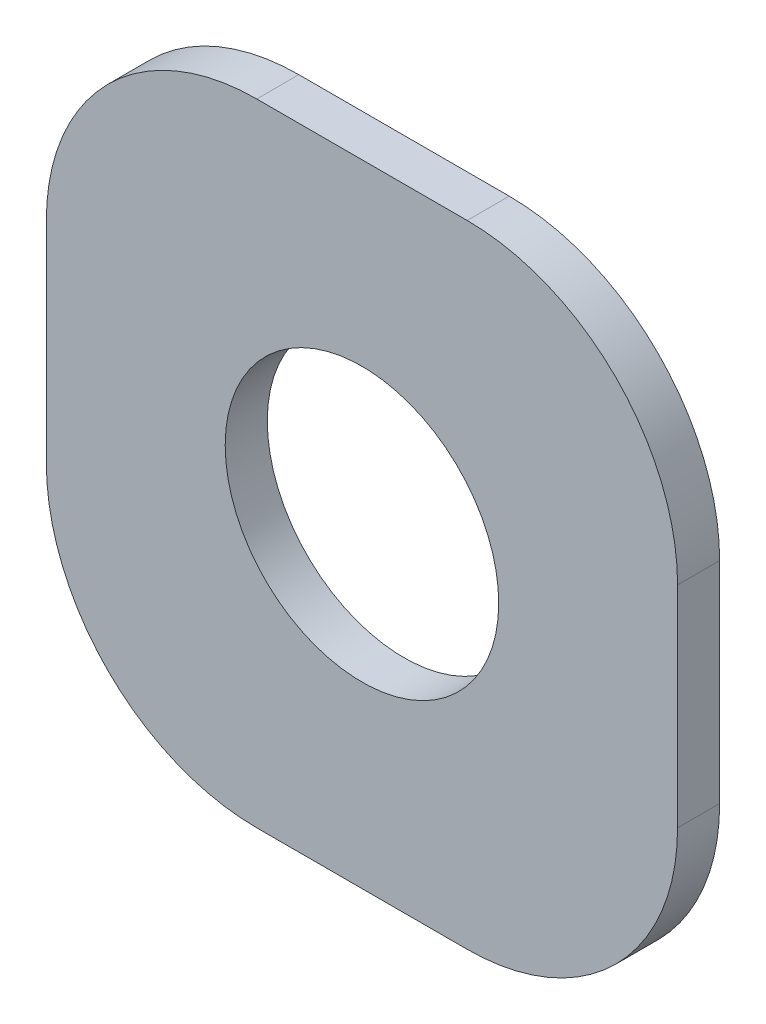
ISO-10303-21;
HEADER;
FILE_DESCRIPTION(('STEP AP214'),'2;1');
FILE_NAME('part.step','',(''),(''),'','','');
FILE_SCHEMA(('AUTOMOTIVE_DESIGN { 1 0 10303 214 1 1 1 1 }'));
ENDSEC;
DATA;
#1=APPLICATION_CONTEXT('core data for automotive mechanical design processes');
#2=APPLICATION_PROTOCOL_DEFINITION('international standard','automotive_design',2000,#1);
#3=PRODUCT_CONTEXT('',#1,'mechanical');
#4=PRODUCT('Part','Part','',(#3));
#5=PRODUCT_RELATED_PRODUCT_CATEGORY('part','',(#4));
#6=PRODUCT_DEFINITION_FORMATION('','',#4);
#7=PRODUCT_DEFINITION_CONTEXT('part definition',#1,'design');
#8=PRODUCT_DEFINITION('design','',#6,#7);
#9=PRODUCT_DEFINITION_SHAPE('','',#8);
#10=(LENGTH_UNIT() NAMED_UNIT(*) SI_UNIT(.MILLI.,.METRE.));
#11=(NAMED_UNIT(*) PLANE_ANGLE_UNIT() SI_UNIT($,.RADIAN.));
#12=(NAMED_UNIT(*) SI_UNIT($,.STERADIAN.) SOLID_ANGLE_UNIT());
#13=UNCERTAINTY_MEASURE_WITH_UNIT(LENGTH_MEASURE(1.E-05),#10,'distance_accuracy_value','');
#14=(GEOMETRIC_REPRESENTATION_CONTEXT(3) GLOBAL_UNCERTAINTY_ASSIGNED_CONTEXT((#13)) GLOBAL_UNIT_ASSIGNED_CONTEXT((#10,
#11,#12)) REPRESENTATION_CONTEXT('',''));
#15=CARTESIAN_POINT('',(0.,0.,0.));
#16=DIRECTION('',(0.,0.,1.));
#17=DIRECTION('',(1.,0.,0.));
#18=AXIS2_PLACEMENT_3D('',#15,#16,#17);
#19=CARTESIAN_POINT('',(-74.9999999999999,-74.9999999999999,75.));
#20=DIRECTION('',(0.,-1.,0.));
#21=DIRECTION('',(0.,0.,-1.));
#22=AXIS2_PLACEMENT_3D('',#19,#20,#21);
#23=PLANE('',#22);
#24=DIRECTION('',(1.,0.,0.));
#25=VECTOR('',#24,1.);
#26=CARTESIAN_POINT('',(-74.9999999999999,-74.9999999999999,75.));
#27=LINE('',#26,#25);
#28=CARTESIAN_POINT('',(-24.9999999999999,-74.9999999999999,75.));
#29=VERTEX_POINT('',#28);
#30=CARTESIAN_POINT('',(25.,-74.9999999999999,75.));
#31=VERTEX_POINT('',#30);
#32=EDGE_CURVE('E190',#29,#31,#27,.T.);
#33=ORIENTED_EDGE('',*,*,#32,.T.);
#34=DIRECTION('',(0.,0.,1.));
#35=VECTOR('',#34,1.);
#36=CARTESIAN_POINT('',(25.,-74.9999999999999,75.));
#37=LINE('',#36,#35);
#38=CARTESIAN_POINT('',(25.,-74.9999999999999,85.));
#39=VERTEX_POINT('',#38);
#40=EDGE_CURVE('E130',#31,#39,#37,.T.);
#41=ORIENTED_EDGE('',*,*,#40,.T.);
#42=DIRECTION('',(1.,0.,0.));
#43=VECTOR('',#42,1.);
#44=CARTESIAN_POINT('',(-74.9999999999999,-74.9999999999999,85.));
#45=LINE('',#44,#43);
#46=CARTESIAN_POINT('',(-24.9999999999999,-74.9999999999999,85.));
#47=VERTEX_POINT('',#46);
#48=EDGE_CURVE('E113',#47,#39,#45,.T.);
#49=ORIENTED_EDGE('',*,*,#48,.F.);
#50=DIRECTION('',(0.,0.,1.));
#51=VECTOR('',#50,1.);
#52=CARTESIAN_POINT('',(-24.9999999999999,-74.9999999999999,75.));
#53=LINE('',#52,#51);
#54=EDGE_CURVE('E127',#47,#29,#53,.F.);
#55=ORIENTED_EDGE('',*,*,#54,.T.);
#56=EDGE_LOOP('',(#33,#41,#49,#55));
#57=FACE_BOUND('',#56,.T.);
#58=ADVANCED_FACE('F44',(#57),#23,.T.);
#59=CARTESIAN_POINT('',(-74.9999999999999,-74.9999999999999,75.));
#60=DIRECTION('',(-1.,0.,0.));
#61=DIRECTION('',(0.,0.,1.));
#62=AXIS2_PLACEMENT_3D('',#59,#60,#61);
#63=PLANE('',#62);
#64=DIRECTION('',(0.,-1.,0.));
#65=VECTOR('',#64,1.);
#66=CARTESIAN_POINT('',(-74.9999999999999,-74.9999999999999,75.));
#67=LINE('',#66,#65);
#68=CARTESIAN_POINT('',(-74.9999999999999,25.,75.));
#69=VERTEX_POINT('',#68);
#70=CARTESIAN_POINT('',(-74.9999999999999,-24.9999999999999,75.));
#71=VERTEX_POINT('',#70);
#72=EDGE_CURVE('E139',#69,#71,#67,.T.);
#73=ORIENTED_EDGE('',*,*,#72,.T.);
#74=DIRECTION('',(0.,0.,1.));
#75=VECTOR('',#74,1.);
#76=CARTESIAN_POINT('',(-74.9999999999999,-24.9999999999999,75.));
#77=LINE('',#76,#75);
#78=CARTESIAN_POINT('',(-74.9999999999999,-24.9999999999999,85.));
#79=VERTEX_POINT('',#78);
#80=EDGE_CURVE('E177',#71,#79,#77,.T.);
#81=ORIENTED_EDGE('',*,*,#80,.T.);
#82=DIRECTION('',(0.,-1.,0.));
#83=VECTOR('',#82,1.);
#84=CARTESIAN_POINT('',(-74.9999999999999,-74.9999999999999,85.));
#85=LINE('',#84,#83);
#86=CARTESIAN_POINT('',(-74.9999999999999,25.,85.));
#87=VERTEX_POINT('',#86);
#88=EDGE_CURVE('E115',#87,#79,#85,.T.);
#89=ORIENTED_EDGE('',*,*,#88,.F.);
#90=DIRECTION('',(0.,0.,1.));
#91=VECTOR('',#90,1.);
#92=CARTESIAN_POINT('',(-74.9999999999999,25.,75.));
#93=LINE('',#92,#91);
#94=EDGE_CURVE('E174',#87,#69,#93,.F.);
#95=ORIENTED_EDGE('',*,*,#94,.T.);
#96=EDGE_LOOP('',(#73,#81,#89,#95));
#97=FACE_BOUND('',#96,.T.);
#98=ADVANCED_FACE('F228',(#97),#63,.T.);
#99=CARTESIAN_POINT('',(-74.9999999999999,75.0000000000001,75.));
#100=DIRECTION('',(0.,1.,0.));
#101=DIRECTION('',(-1.,0.,0.));
#102=AXIS2_PLACEMENT_3D('',#99,#100,#101);
#103=PLANE('',#102);
#104=DIRECTION('',(-1.,0.,0.));
#105=VECTOR('',#104,1.);
#106=CARTESIAN_POINT('',(-74.9999999999999,75.0000000000001,85.));
#107=LINE('',#106,#105);
#108=CARTESIAN_POINT('',(25.,75.,85.));
#109=VERTEX_POINT('',#108);
#110=CARTESIAN_POINT('',(-24.9999999999998,75.,85.));
#111=VERTEX_POINT('',#110);
#112=EDGE_CURVE('E184',#109,#111,#107,.T.);
#113=ORIENTED_EDGE('',*,*,#112,.F.);
#114=DIRECTION('',(0.,0.,1.));
#115=VECTOR('',#114,1.);
#116=CARTESIAN_POINT('',(25.,75.,75.));
#117=LINE('',#116,#115);
#118=CARTESIAN_POINT('',(25.,75.,75.));
#119=VERTEX_POINT('',#118);
#120=EDGE_CURVE('E11',#109,#119,#117,.F.);
#121=ORIENTED_EDGE('',*,*,#120,.T.);
#122=DIRECTION('',(-1.,0.,0.));
#123=VECTOR('',#122,1.);
#124=CARTESIAN_POINT('',(-74.9999999999999,75.0000000000001,75.));
#125=LINE('',#124,#123);
#126=CARTESIAN_POINT('',(-24.9999999999998,75.,75.));
#127=VERTEX_POINT('',#126);
#128=EDGE_CURVE('E146',#119,#127,#125,.T.);
#129=ORIENTED_EDGE('',*,*,#128,.T.);
#130=DIRECTION('',(0.,0.,1.));
#131=VECTOR('',#130,1.);
#132=CARTESIAN_POINT('',(-24.9999999999998,75.,75.));
#133=LINE('',#132,#131);
#134=EDGE_CURVE('E53',#127,#111,#133,.T.);
#135=ORIENTED_EDGE('',*,*,#134,.T.);
#136=EDGE_LOOP('',(#113,#121,#129,#135));
#137=FACE_BOUND('',#136,.T.);
#138=ADVANCED_FACE('F183',(#137),#103,.T.);
#139=CARTESIAN_POINT('',(75.0000000000001,-74.9999999999999,75.));
#140=DIRECTION('',(1.,0.,0.));
#141=DIRECTION('',(0.,1.,0.));
#142=AXIS2_PLACEMENT_3D('',#139,#140,#141);
#143=PLANE('',#142);
#144=DIRECTION('',(0.,1.,0.));
#145=VECTOR('',#144,1.);
#146=CARTESIAN_POINT('',(75.0000000000001,-74.9999999999999,85.));
#147=LINE('',#146,#145);
#148=CARTESIAN_POINT('',(75.0000000000001,-24.9999999999999,85.));
#149=VERTEX_POINT('',#148);
#150=CARTESIAN_POINT('',(75.,25.,85.));
#151=VERTEX_POINT('',#150);
#152=EDGE_CURVE('E132',#149,#151,#147,.T.);
#153=ORIENTED_EDGE('',*,*,#152,.F.);
#154=DIRECTION('',(0.,0.,1.));
#155=VECTOR('',#154,1.);
#156=CARTESIAN_POINT('',(75.0000000000001,-24.9999999999999,75.));
#157=LINE('',#156,#155);
#158=CARTESIAN_POINT('',(75.0000000000001,-24.9999999999999,75.));
#159=VERTEX_POINT('',#158);
#160=EDGE_CURVE('E161',#149,#159,#157,.F.);
#161=ORIENTED_EDGE('',*,*,#160,.T.);
#162=DIRECTION('',(0.,1.,0.));
#163=VECTOR('',#162,1.);
#164=CARTESIAN_POINT('',(75.0000000000001,-74.9999999999999,75.));
#165=LINE('',#164,#163);
#166=CARTESIAN_POINT('',(75.,25.,75.));
#167=VERTEX_POINT('',#166);
#168=EDGE_CURVE('E195',#159,#167,#165,.T.);
#169=ORIENTED_EDGE('',*,*,#168,.T.);
#170=DIRECTION('',(0.,0.,1.));
#171=VECTOR('',#170,1.);
#172=CARTESIAN_POINT('',(75.,25.,75.));
#173=LINE('',#172,#171);
#174=EDGE_CURVE('E157',#167,#151,#173,.T.);
#175=ORIENTED_EDGE('',*,*,#174,.T.);
#176=EDGE_LOOP('',(#153,#161,#169,#175));
#177=FACE_BOUND('',#176,.T.);
#178=ADVANCED_FACE('F224',(#177),#143,.T.);
#179=CARTESIAN_POINT('',(0.,0.,75.));
#180=DIRECTION('',(0.,0.,1.));
#181=DIRECTION('',(1.,0.,0.));
#182=AXIS2_PLACEMENT_3D('',#179,#180,#181);
#183=PLANE('',#182);
#184=CARTESIAN_POINT('',(0.,0.,75.));
#185=DIRECTION('',(0.,0.,1.));
#186=DIRECTION('',(1.,0.,0.));
#187=AXIS2_PLACEMENT_3D('',#184,#185,#186);
#188=CIRCLE('',#187,32.5);
#189=CARTESIAN_POINT('',(32.5,0.,75.));
#190=VERTEX_POINT('',#189);
#191=EDGE_CURVE('E133',#190,#190,#188,.T.);
#192=ORIENTED_EDGE('',*,*,#191,.T.);
#193=EDGE_LOOP('',(#192));
#194=FACE_BOUND('',#193,.T.);
#195=ORIENTED_EDGE('',*,*,#168,.F.);
#196=CARTESIAN_POINT('',(25.,-24.9999999999999,75.));
#197=DIRECTION('',(0.,0.,1.));
#198=DIRECTION('',(1.,0.,0.));
#199=AXIS2_PLACEMENT_3D('',#196,#197,#198);
#200=CIRCLE('',#199,50.);
#201=EDGE_CURVE('E171',#159,#31,#200,.F.);
#202=ORIENTED_EDGE('',*,*,#201,.T.);
#203=ORIENTED_EDGE('',*,*,#32,.F.);
#204=CARTESIAN_POINT('',(-24.9999999999999,-24.9999999999999,75.));
#205=DIRECTION('',(0.,0.,1.));
#206=DIRECTION('',(1.,0.,0.));
#207=AXIS2_PLACEMENT_3D('',#204,#205,#206);
#208=CIRCLE('',#207,50.);
#209=EDGE_CURVE('E137',#29,#71,#208,.F.);
#210=ORIENTED_EDGE('',*,*,#209,.T.);
#211=ORIENTED_EDGE('',*,*,#72,.F.);
#212=CARTESIAN_POINT('',(-24.9999999999999,25.,75.));
#213=DIRECTION('',(0.,0.,1.));
#214=DIRECTION('',(1.,0.,0.));
#215=AXIS2_PLACEMENT_3D('',#212,#213,#214);
#216=CIRCLE('',#215,50.);
#217=EDGE_CURVE('E60',#69,#127,#216,.F.);
#218=ORIENTED_EDGE('',*,*,#217,.T.);
#219=ORIENTED_EDGE('',*,*,#128,.F.);
#220=CARTESIAN_POINT('',(25.,25.,75.));
#221=DIRECTION('',(0.,0.,1.));
#222=DIRECTION('',(1.,0.,0.));
#223=AXIS2_PLACEMENT_3D('',#220,#221,#222);
#224=CIRCLE('',#223,50.);
#225=EDGE_CURVE('E166',#119,#167,#224,.F.);
#226=ORIENTED_EDGE('',*,*,#225,.T.);
#227=EDGE_LOOP('',(#195,#202,#203,#210,#211,#218,#219,#226));
#228=FACE_BOUND('',#227,.T.);
#229=ADVANCED_FACE('F209',(#194,#228),#183,.F.);
#230=CARTESIAN_POINT('',(0.,0.,85.));
#231=DIRECTION('',(0.,0.,1.));
#232=DIRECTION('',(1.,0.,0.));
#233=AXIS2_PLACEMENT_3D('',#230,#231,#232);
#234=PLANE('',#233);
#235=CARTESIAN_POINT('',(0.,0.,85.));
#236=DIRECTION('',(0.,0.,1.));
#237=DIRECTION('',(1.,0.,0.));
#238=AXIS2_PLACEMENT_3D('',#235,#236,#237);
#239=CIRCLE('',#238,32.5);
#240=CARTESIAN_POINT('',(32.5,0.,85.));
#241=VERTEX_POINT('',#240);
#242=EDGE_CURVE('E201',#241,#241,#239,.T.);
#243=ORIENTED_EDGE('',*,*,#242,.F.);
#244=EDGE_LOOP('',(#243));
#245=FACE_BOUND('',#244,.T.);
#246=ORIENTED_EDGE('',*,*,#48,.T.);
#247=CARTESIAN_POINT('',(25.,-24.9999999999999,85.));
#248=DIRECTION('',(0.,0.,1.));
#249=DIRECTION('',(1.,0.,0.));
#250=AXIS2_PLACEMENT_3D('',#247,#248,#249);
#251=CIRCLE('',#250,50.);
#252=EDGE_CURVE('E121',#39,#149,#251,.T.);
#253=ORIENTED_EDGE('',*,*,#252,.T.);
#254=ORIENTED_EDGE('',*,*,#152,.T.);
#255=CARTESIAN_POINT('',(25.,25.,85.));
#256=DIRECTION('',(0.,0.,1.));
#257=DIRECTION('',(1.,0.,0.));
#258=AXIS2_PLACEMENT_3D('',#255,#256,#257);
#259=CIRCLE('',#258,50.);
#260=EDGE_CURVE('E122',#151,#109,#259,.T.);
#261=ORIENTED_EDGE('',*,*,#260,.T.);
#262=ORIENTED_EDGE('',*,*,#112,.T.);
#263=CARTESIAN_POINT('',(-24.9999999999999,25.,85.));
#264=DIRECTION('',(0.,0.,1.));
#265=DIRECTION('',(1.,0.,0.));
#266=AXIS2_PLACEMENT_3D('',#263,#264,#265);
#267=CIRCLE('',#266,50.);
#268=EDGE_CURVE('E143',#111,#87,#267,.T.);
#269=ORIENTED_EDGE('',*,*,#268,.T.);
#270=ORIENTED_EDGE('',*,*,#88,.T.);
#271=CARTESIAN_POINT('',(-24.9999999999999,-24.9999999999999,85.));
#272=DIRECTION('',(0.,0.,1.));
#273=DIRECTION('',(1.,0.,0.));
#274=AXIS2_PLACEMENT_3D('',#271,#272,#273);
#275=CIRCLE('',#274,50.);
#276=EDGE_CURVE('E110',#79,#47,#275,.T.);
#277=ORIENTED_EDGE('',*,*,#276,.T.);
#278=EDGE_LOOP('',(#246,#253,#254,#261,#262,#269,#270,#277));
#279=FACE_BOUND('',#278,.T.);
#280=ADVANCED_FACE('F112',(#245,#279),#234,.T.);
#281=CARTESIAN_POINT('',(0.,0.,75.));
#282=DIRECTION('',(0.,0.,1.));
#283=DIRECTION('',(1.,0.,0.));
#284=AXIS2_PLACEMENT_3D('',#281,#282,#283);
#285=CYLINDRICAL_SURFACE('',#284,32.5);
#286=ORIENTED_EDGE('',*,*,#191,.F.);
#287=EDGE_LOOP('',(#286));
#288=FACE_BOUND('',#287,.T.);
#289=ORIENTED_EDGE('',*,*,#242,.T.);
#290=EDGE_LOOP('',(#289));
#291=FACE_BOUND('',#290,.T.);
#292=ADVANCED_FACE('F211',(#288,#291),#285,.F.);
#293=CARTESIAN_POINT('',(25.,-24.9999999999999,75.));
#294=DIRECTION('',(0.,0.,1.));
#295=DIRECTION('',(1.,0.,0.));
#296=AXIS2_PLACEMENT_3D('',#293,#294,#295);
#297=CYLINDRICAL_SURFACE('',#296,50.);
#298=ORIENTED_EDGE('',*,*,#201,.F.);
#299=ORIENTED_EDGE('',*,*,#160,.F.);
#300=ORIENTED_EDGE('',*,*,#252,.F.);
#301=ORIENTED_EDGE('',*,*,#40,.F.);
#302=EDGE_LOOP('',(#298,#299,#300,#301));
#303=FACE_BOUND('',#302,.T.);
#304=ADVANCED_FACE('F214',(#303),#297,.T.);
#305=CARTESIAN_POINT('',(-24.9999999999999,-24.9999999999999,75.));
#306=DIRECTION('',(0.,0.,1.));
#307=DIRECTION('',(1.,0.,0.));
#308=AXIS2_PLACEMENT_3D('',#305,#306,#307);
#309=CYLINDRICAL_SURFACE('',#308,50.);
#310=ORIENTED_EDGE('',*,*,#209,.F.);
#311=ORIENTED_EDGE('',*,*,#54,.F.);
#312=ORIENTED_EDGE('',*,*,#276,.F.);
#313=ORIENTED_EDGE('',*,*,#80,.F.);
#314=EDGE_LOOP('',(#310,#311,#312,#313));
#315=FACE_BOUND('',#314,.T.);
#316=ADVANCED_FACE('F136',(#315),#309,.T.);
#317=CARTESIAN_POINT('',(25.,25.,75.));
#318=DIRECTION('',(0.,0.,1.));
#319=DIRECTION('',(1.,0.,0.));
#320=AXIS2_PLACEMENT_3D('',#317,#318,#319);
#321=CYLINDRICAL_SURFACE('',#320,50.);
#322=ORIENTED_EDGE('',*,*,#225,.F.);
#323=ORIENTED_EDGE('',*,*,#120,.F.);
#324=ORIENTED_EDGE('',*,*,#260,.F.);
#325=ORIENTED_EDGE('',*,*,#174,.F.);
#326=EDGE_LOOP('',(#322,#323,#324,#325));
#327=FACE_BOUND('',#326,.T.);
#328=ADVANCED_FACE('F240',(#327),#321,.T.);
#329=CARTESIAN_POINT('',(-24.9999999999999,25.,75.));
#330=DIRECTION('',(0.,0.,1.));
#331=DIRECTION('',(1.,0.,0.));
#332=AXIS2_PLACEMENT_3D('',#329,#330,#331);
#333=CYLINDRICAL_SURFACE('',#332,50.);
#334=ORIENTED_EDGE('',*,*,#217,.F.);
#335=ORIENTED_EDGE('',*,*,#94,.F.);
#336=ORIENTED_EDGE('',*,*,#268,.F.);
#337=ORIENTED_EDGE('',*,*,#134,.F.);
#338=EDGE_LOOP('',(#334,#335,#336,#337));
#339=FACE_BOUND('',#338,.T.);
#340=ADVANCED_FACE('F46',(#339),#333,.T.);
#341=CLOSED_SHELL('',(#58,#98,#138,#178,#229,#280,#292,#304,#316,#328,#340));
#342=MANIFOLD_SOLID_BREP('B2',#341);
#343=ADVANCED_BREP_SHAPE_REPRESENTATION('',(#18,#342),#14);
#344=SHAPE_DEFINITION_REPRESENTATION(#9,#343);
ENDSEC;
END-ISO-10303-21;
